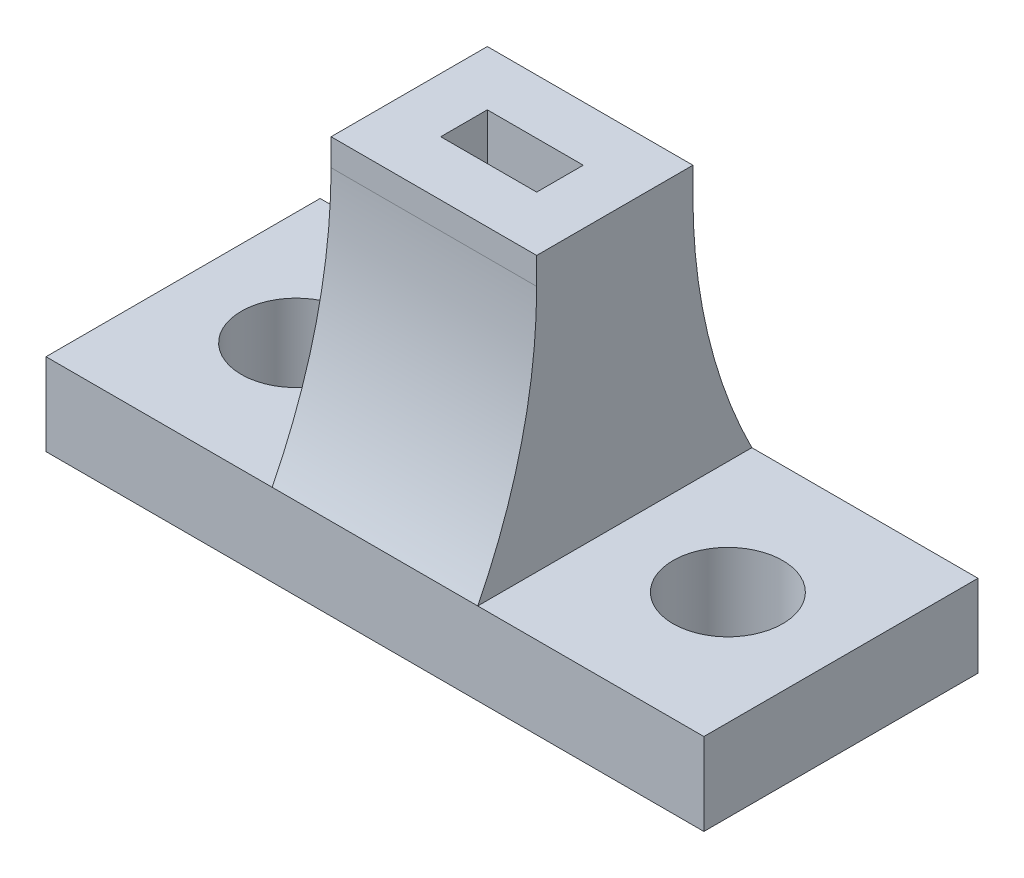
ISO-10303-21;
HEADER;
FILE_DESCRIPTION(('STEP AP214'),'2;1');
FILE_NAME('part.step','',(''),(''),'','','');
FILE_SCHEMA(('AUTOMOTIVE_DESIGN { 1 0 10303 214 1 1 1 1 }'));
ENDSEC;
DATA;
#1=APPLICATION_CONTEXT('core data for automotive mechanical design processes');
#2=APPLICATION_PROTOCOL_DEFINITION('international standard','automotive_design',2000,#1);
#3=PRODUCT_CONTEXT('',#1,'mechanical');
#4=PRODUCT('Part','Part','',(#3));
#5=PRODUCT_RELATED_PRODUCT_CATEGORY('part','',(#4));
#6=PRODUCT_DEFINITION_FORMATION('','',#4);
#7=PRODUCT_DEFINITION_CONTEXT('part definition',#1,'design');
#8=PRODUCT_DEFINITION('design','',#6,#7);
#9=PRODUCT_DEFINITION_SHAPE('','',#8);
#10=(LENGTH_UNIT() NAMED_UNIT(*) SI_UNIT(.MILLI.,.METRE.));
#11=(NAMED_UNIT(*) PLANE_ANGLE_UNIT() SI_UNIT($,.RADIAN.));
#12=(NAMED_UNIT(*) SI_UNIT($,.STERADIAN.) SOLID_ANGLE_UNIT());
#13=UNCERTAINTY_MEASURE_WITH_UNIT(LENGTH_MEASURE(1.E-05),#10,'distance_accuracy_value','');
#14=(GEOMETRIC_REPRESENTATION_CONTEXT(3) GLOBAL_UNCERTAINTY_ASSIGNED_CONTEXT((#13)) GLOBAL_UNIT_ASSIGNED_CONTEXT((#10,
#11,#12)) REPRESENTATION_CONTEXT('',''));
#15=CARTESIAN_POINT('',(0.,0.,0.));
#16=DIRECTION('',(0.,0.,1.));
#17=DIRECTION('',(1.,0.,0.));
#18=AXIS2_PLACEMENT_3D('',#15,#16,#17);
#19=CARTESIAN_POINT('',(0.,0.,0.));
#20=DIRECTION('',(0.,-1.,0.));
#21=DIRECTION('',(0.,0.,-1.));
#22=AXIS2_PLACEMENT_3D('',#19,#20,#21);
#23=PLANE('',#22);
#24=CARTESIAN_POINT('',(-7.875,0.,0.));
#25=DIRECTION('',(0.,1.,0.));
#26=DIRECTION('',(0.,0.,1.));
#27=AXIS2_PLACEMENT_3D('',#24,#25,#26);
#28=CIRCLE('',#27,2.);
#29=CARTESIAN_POINT('',(-7.875,0.,2.));
#30=VERTEX_POINT('',#29);
#31=EDGE_CURVE('E369',#30,#30,#28,.T.);
#32=ORIENTED_EDGE('',*,*,#31,.F.);
#33=EDGE_LOOP('',(#32));
#34=FACE_BOUND('',#33,.T.);
#35=DIRECTION('',(0.,0.,1.));
#36=VECTOR('',#35,1.);
#37=CARTESIAN_POINT('',(-3.75,0.,-2.85));
#38=LINE('',#37,#36);
#39=CARTESIAN_POINT('',(-3.75,0.,-5.));
#40=VERTEX_POINT('',#39);
#41=CARTESIAN_POINT('',(-3.75,0.,5.));
#42=VERTEX_POINT('',#41);
#43=EDGE_CURVE('E224',#40,#42,#38,.T.);
#44=ORIENTED_EDGE('',*,*,#43,.F.);
#45=DIRECTION('',(1.,0.,0.));
#46=VECTOR('',#45,1.);
#47=CARTESIAN_POINT('',(-12.,0.,-5.));
#48=LINE('',#47,#46);
#49=CARTESIAN_POINT('',(-12.,0.,-5.));
#50=VERTEX_POINT('',#49);
#51=EDGE_CURVE('E164',#50,#40,#48,.T.);
#52=ORIENTED_EDGE('',*,*,#51,.F.);
#53=DIRECTION('',(0.,0.,-1.));
#54=VECTOR('',#53,1.);
#55=CARTESIAN_POINT('',(-12.,0.,5.));
#56=LINE('',#55,#54);
#57=CARTESIAN_POINT('',(-12.,0.,5.));
#58=VERTEX_POINT('',#57);
#59=EDGE_CURVE('E276',#58,#50,#56,.T.);
#60=ORIENTED_EDGE('',*,*,#59,.F.);
#61=DIRECTION('',(-1.,0.,0.));
#62=VECTOR('',#61,1.);
#63=CARTESIAN_POINT('',(-12.,0.,5.));
#64=LINE('',#63,#62);
#65=EDGE_CURVE('E278',#42,#58,#64,.T.);
#66=ORIENTED_EDGE('',*,*,#65,.F.);
#67=EDGE_LOOP('',(#44,#52,#60,#66));
#68=FACE_BOUND('',#67,.T.);
#69=ADVANCED_FACE('F39',(#34,#68),#23,.F.);
#70=CARTESIAN_POINT('',(0.,10.,0.));
#71=DIRECTION('',(0.,1.,0.));
#72=DIRECTION('',(0.,0.,1.));
#73=AXIS2_PLACEMENT_3D('',#70,#71,#72);
#74=PLANE('',#73);
#75=DIRECTION('',(0.,0.,-1.));
#76=VECTOR('',#75,1.);
#77=CARTESIAN_POINT('',(3.75,10.,-2.85));
#78=LINE('',#77,#76);
#79=CARTESIAN_POINT('',(3.75,10.,2.85));
#80=VERTEX_POINT('',#79);
#81=CARTESIAN_POINT('',(3.75,10.,-2.85));
#82=VERTEX_POINT('',#81);
#83=EDGE_CURVE('E219',#80,#82,#78,.T.);
#84=ORIENTED_EDGE('',*,*,#83,.T.);
#85=DIRECTION('',(-1.,0.,0.));
#86=VECTOR('',#85,1.);
#87=CARTESIAN_POINT('',(-3.75,10.,-2.85));
#88=LINE('',#87,#86);
#89=CARTESIAN_POINT('',(-3.75,10.,-2.85));
#90=VERTEX_POINT('',#89);
#91=EDGE_CURVE('E223',#82,#90,#88,.T.);
#92=ORIENTED_EDGE('',*,*,#91,.T.);
#93=DIRECTION('',(0.,0.,1.));
#94=VECTOR('',#93,1.);
#95=CARTESIAN_POINT('',(-3.75,10.,-2.85));
#96=LINE('',#95,#94);
#97=CARTESIAN_POINT('',(-3.75,10.,2.85));
#98=VERTEX_POINT('',#97);
#99=EDGE_CURVE('E227',#90,#98,#96,.T.);
#100=ORIENTED_EDGE('',*,*,#99,.T.);
#101=DIRECTION('',(1.,0.,0.));
#102=VECTOR('',#101,1.);
#103=CARTESIAN_POINT('',(-3.75,10.,2.85));
#104=LINE('',#103,#102);
#105=EDGE_CURVE('E230',#98,#80,#104,.T.);
#106=ORIENTED_EDGE('',*,*,#105,.T.);
#107=EDGE_LOOP('',(#84,#92,#100,#106));
#108=FACE_BOUND('',#107,.T.);
#109=DIRECTION('',(-1.,0.,0.));
#110=VECTOR('',#109,1.);
#111=CARTESIAN_POINT('',(-1.75,10.,-0.85));
#112=LINE('',#111,#110);
#113=CARTESIAN_POINT('',(1.75,10.,-0.85));
#114=VERTEX_POINT('',#113);
#115=CARTESIAN_POINT('',(-1.75,10.,-0.85));
#116=VERTEX_POINT('',#115);
#117=EDGE_CURVE('E184',#114,#116,#112,.T.);
#118=ORIENTED_EDGE('',*,*,#117,.F.);
#119=DIRECTION('',(0.,0.,-1.));
#120=VECTOR('',#119,1.);
#121=CARTESIAN_POINT('',(1.75,10.,-0.85));
#122=LINE('',#121,#120);
#123=CARTESIAN_POINT('',(1.75,10.,0.85));
#124=VERTEX_POINT('',#123);
#125=EDGE_CURVE('E181',#124,#114,#122,.T.);
#126=ORIENTED_EDGE('',*,*,#125,.F.);
#127=DIRECTION('',(1.,0.,0.));
#128=VECTOR('',#127,1.);
#129=CARTESIAN_POINT('',(-1.75,10.,0.85));
#130=LINE('',#129,#128);
#131=CARTESIAN_POINT('',(-1.75,10.,0.85));
#132=VERTEX_POINT('',#131);
#133=EDGE_CURVE('E192',#132,#124,#130,.T.);
#134=ORIENTED_EDGE('',*,*,#133,.F.);
#135=DIRECTION('',(0.,0.,1.));
#136=VECTOR('',#135,1.);
#137=CARTESIAN_POINT('',(-1.75,10.,-0.85));
#138=LINE('',#137,#136);
#139=EDGE_CURVE('E188',#116,#132,#138,.T.);
#140=ORIENTED_EDGE('',*,*,#139,.F.);
#141=EDGE_LOOP('',(#118,#126,#134,#140));
#142=FACE_BOUND('',#141,.T.);
#143=ADVANCED_FACE('F316',(#108,#142),#74,.T.);
#144=CARTESIAN_POINT('',(3.75,10.,-2.85));
#145=DIRECTION('',(-1.,0.,0.));
#146=DIRECTION('',(0.,0.,1.));
#147=AXIS2_PLACEMENT_3D('',#144,#145,#146);
#148=PLANE('',#147);
#149=DIRECTION('',(0.,0.,-1.));
#150=VECTOR('',#149,1.);
#151=CARTESIAN_POINT('',(3.75,0.,-2.85));
#152=LINE('',#151,#150);
#153=CARTESIAN_POINT('',(3.75,0.,5.));
#154=VERTEX_POINT('',#153);
#155=CARTESIAN_POINT('',(3.75,0.,-5.));
#156=VERTEX_POINT('',#155);
#157=EDGE_CURVE('E218',#154,#156,#152,.T.);
#158=ORIENTED_EDGE('',*,*,#157,.T.);
#159=CARTESIAN_POINT('',(3.75,9.02094784376897,-22.85));
#160=DIRECTION('',(-1.,0.,0.));
#161=DIRECTION('',(0.,0.,1.));
#162=AXIS2_PLACEMENT_3D('',#159,#160,#161);
#163=CIRCLE('',#162,20.);
#164=CARTESIAN_POINT('',(3.75,9.02094784376896,-2.85));
#165=VERTEX_POINT('',#164);
#166=EDGE_CURVE('E263',#156,#165,#163,.T.);
#167=ORIENTED_EDGE('',*,*,#166,.T.);
#168=DIRECTION('',(0.,-1.,0.));
#169=VECTOR('',#168,1.);
#170=CARTESIAN_POINT('',(3.75,10.,-2.85));
#171=LINE('',#170,#169);
#172=EDGE_CURVE('E248',#82,#165,#171,.T.);
#173=ORIENTED_EDGE('',*,*,#172,.F.);
#174=ORIENTED_EDGE('',*,*,#83,.F.);
#175=DIRECTION('',(0.,-1.,0.));
#176=VECTOR('',#175,1.);
#177=CARTESIAN_POINT('',(3.75,10.,2.85));
#178=LINE('',#177,#176);
#179=CARTESIAN_POINT('',(3.75,9.02094784376897,2.85));
#180=VERTEX_POINT('',#179);
#181=EDGE_CURVE('E233',#80,#180,#178,.T.);
#182=ORIENTED_EDGE('',*,*,#181,.T.);
#183=CARTESIAN_POINT('',(3.75,9.02094784376897,22.85));
#184=DIRECTION('',(-1.,0.,0.));
#185=DIRECTION('',(0.,0.,1.));
#186=AXIS2_PLACEMENT_3D('',#183,#184,#185);
#187=CIRCLE('',#186,20.);
#188=EDGE_CURVE('E48',#180,#154,#187,.T.);
#189=ORIENTED_EDGE('',*,*,#188,.T.);
#190=EDGE_LOOP('',(#158,#167,#173,#174,#182,#189));
#191=FACE_BOUND('',#190,.T.);
#192=ADVANCED_FACE('F267',(#191),#148,.F.);
#193=CARTESIAN_POINT('',(-3.75,10.,-2.85));
#194=DIRECTION('',(0.,0.,1.));
#195=DIRECTION('',(1.,0.,0.));
#196=AXIS2_PLACEMENT_3D('',#193,#194,#195);
#197=PLANE('',#196);
#198=ORIENTED_EDGE('',*,*,#172,.T.);
#199=DIRECTION('',(-1.,0.,0.));
#200=VECTOR('',#199,1.);
#201=CARTESIAN_POINT('',(-3.75,9.02094784376897,-2.85));
#202=LINE('',#201,#200);
#203=CARTESIAN_POINT('',(-3.75,9.02094784376896,-2.85));
#204=VERTEX_POINT('',#203);
#205=EDGE_CURVE('E252',#165,#204,#202,.T.);
#206=ORIENTED_EDGE('',*,*,#205,.T.);
#207=DIRECTION('',(0.,-1.,0.));
#208=VECTOR('',#207,1.);
#209=CARTESIAN_POINT('',(-3.75,10.,-2.85));
#210=LINE('',#209,#208);
#211=EDGE_CURVE('E244',#90,#204,#210,.T.);
#212=ORIENTED_EDGE('',*,*,#211,.F.);
#213=ORIENTED_EDGE('',*,*,#91,.F.);
#214=EDGE_LOOP('',(#198,#206,#212,#213));
#215=FACE_BOUND('',#214,.T.);
#216=ADVANCED_FACE('F313',(#215),#197,.F.);
#217=CARTESIAN_POINT('',(-3.75,10.,-2.85));
#218=DIRECTION('',(1.,0.,0.));
#219=DIRECTION('',(0.,0.,-1.));
#220=AXIS2_PLACEMENT_3D('',#217,#218,#219);
#221=PLANE('',#220);
#222=ORIENTED_EDGE('',*,*,#43,.T.);
#223=CARTESIAN_POINT('',(-3.75,9.02094784376897,22.85));
#224=DIRECTION('',(1.,0.,0.));
#225=DIRECTION('',(0.,0.,-1.));
#226=AXIS2_PLACEMENT_3D('',#223,#224,#225);
#227=CIRCLE('',#226,20.);
#228=CARTESIAN_POINT('',(-3.75,9.02094784376897,2.85));
#229=VERTEX_POINT('',#228);
#230=EDGE_CURVE('E11',#42,#229,#227,.T.);
#231=ORIENTED_EDGE('',*,*,#230,.T.);
#232=DIRECTION('',(0.,-1.,0.));
#233=VECTOR('',#232,1.);
#234=CARTESIAN_POINT('',(-3.75,10.,2.85));
#235=LINE('',#234,#233);
#236=EDGE_CURVE('E241',#98,#229,#235,.T.);
#237=ORIENTED_EDGE('',*,*,#236,.F.);
#238=ORIENTED_EDGE('',*,*,#99,.F.);
#239=ORIENTED_EDGE('',*,*,#211,.T.);
#240=CARTESIAN_POINT('',(-3.75,9.02094784376897,-22.85));
#241=DIRECTION('',(1.,0.,0.));
#242=DIRECTION('',(0.,0.,-1.));
#243=AXIS2_PLACEMENT_3D('',#240,#241,#242);
#244=CIRCLE('',#243,20.);
#245=EDGE_CURVE('E259',#204,#40,#244,.T.);
#246=ORIENTED_EDGE('',*,*,#245,.T.);
#247=EDGE_LOOP('',(#222,#231,#237,#238,#239,#246));
#248=FACE_BOUND('',#247,.T.);
#249=ADVANCED_FACE('F305',(#248),#221,.F.);
#250=CARTESIAN_POINT('',(-3.75,10.,2.85));
#251=DIRECTION('',(0.,0.,-1.));
#252=DIRECTION('',(-1.,0.,0.));
#253=AXIS2_PLACEMENT_3D('',#250,#251,#252);
#254=PLANE('',#253);
#255=ORIENTED_EDGE('',*,*,#236,.T.);
#256=DIRECTION('',(1.,0.,0.));
#257=VECTOR('',#256,1.);
#258=CARTESIAN_POINT('',(-3.75,9.02094784376897,2.85));
#259=LINE('',#258,#257);
#260=EDGE_CURVE('E256',#229,#180,#259,.T.);
#261=ORIENTED_EDGE('',*,*,#260,.T.);
#262=ORIENTED_EDGE('',*,*,#181,.F.);
#263=ORIENTED_EDGE('',*,*,#105,.F.);
#264=EDGE_LOOP('',(#255,#261,#262,#263));
#265=FACE_BOUND('',#264,.T.);
#266=ADVANCED_FACE('F320',(#265),#254,.F.);
#267=CARTESIAN_POINT('',(1.75,10.,-0.85));
#268=DIRECTION('',(-1.,0.,0.));
#269=DIRECTION('',(0.,0.,1.));
#270=AXIS2_PLACEMENT_3D('',#267,#268,#269);
#271=PLANE('',#270);
#272=DIRECTION('',(0.,0.,-1.));
#273=VECTOR('',#272,1.);
#274=CARTESIAN_POINT('',(1.75,0.,-0.85));
#275=LINE('',#274,#273);
#276=CARTESIAN_POINT('',(1.75,0.,0.85));
#277=VERTEX_POINT('',#276);
#278=CARTESIAN_POINT('',(1.75,0.,-0.85));
#279=VERTEX_POINT('',#278);
#280=EDGE_CURVE('E170',#277,#279,#275,.T.);
#281=ORIENTED_EDGE('',*,*,#280,.F.);
#282=DIRECTION('',(0.,-1.,0.));
#283=VECTOR('',#282,1.);
#284=CARTESIAN_POINT('',(1.75,10.,0.85));
#285=LINE('',#284,#283);
#286=EDGE_CURVE('E194',#124,#277,#285,.T.);
#287=ORIENTED_EDGE('',*,*,#286,.F.);
#288=ORIENTED_EDGE('',*,*,#125,.T.);
#289=DIRECTION('',(0.,-1.,0.));
#290=VECTOR('',#289,1.);
#291=CARTESIAN_POINT('',(1.75,10.,-0.85));
#292=LINE('',#291,#290);
#293=EDGE_CURVE('E214',#114,#279,#292,.T.);
#294=ORIENTED_EDGE('',*,*,#293,.T.);
#295=EDGE_LOOP('',(#281,#287,#288,#294));
#296=FACE_BOUND('',#295,.T.);
#297=ADVANCED_FACE('F322',(#296),#271,.T.);
#298=CARTESIAN_POINT('',(-1.75,10.,-0.85));
#299=DIRECTION('',(0.,0.,1.));
#300=DIRECTION('',(1.,0.,0.));
#301=AXIS2_PLACEMENT_3D('',#298,#299,#300);
#302=PLANE('',#301);
#303=DIRECTION('',(-1.,0.,0.));
#304=VECTOR('',#303,1.);
#305=CARTESIAN_POINT('',(-1.75,0.,-0.85));
#306=LINE('',#305,#304);
#307=CARTESIAN_POINT('',(-1.75,0.,-0.85));
#308=VERTEX_POINT('',#307);
#309=EDGE_CURVE('E175',#279,#308,#306,.T.);
#310=ORIENTED_EDGE('',*,*,#309,.F.);
#311=ORIENTED_EDGE('',*,*,#293,.F.);
#312=ORIENTED_EDGE('',*,*,#117,.T.);
#313=DIRECTION('',(0.,-1.,0.));
#314=VECTOR('',#313,1.);
#315=CARTESIAN_POINT('',(-1.75,10.,-0.85));
#316=LINE('',#315,#314);
#317=EDGE_CURVE('E211',#116,#308,#316,.T.);
#318=ORIENTED_EDGE('',*,*,#317,.T.);
#319=EDGE_LOOP('',(#310,#311,#312,#318));
#320=FACE_BOUND('',#319,.T.);
#321=ADVANCED_FACE('F328',(#320),#302,.T.);
#322=CARTESIAN_POINT('',(-1.75,10.,-0.85));
#323=DIRECTION('',(1.,0.,0.));
#324=DIRECTION('',(0.,0.,-1.));
#325=AXIS2_PLACEMENT_3D('',#322,#323,#324);
#326=PLANE('',#325);
#327=DIRECTION('',(0.,0.,1.));
#328=VECTOR('',#327,1.);
#329=CARTESIAN_POINT('',(-1.75,0.,-0.85));
#330=LINE('',#329,#328);
#331=CARTESIAN_POINT('',(-1.75,0.,0.85));
#332=VERTEX_POINT('',#331);
#333=EDGE_CURVE('E199',#308,#332,#330,.T.);
#334=ORIENTED_EDGE('',*,*,#333,.F.);
#335=ORIENTED_EDGE('',*,*,#317,.F.);
#336=ORIENTED_EDGE('',*,*,#139,.T.);
#337=DIRECTION('',(0.,-1.,0.));
#338=VECTOR('',#337,1.);
#339=CARTESIAN_POINT('',(-1.75,10.,0.85));
#340=LINE('',#339,#338);
#341=EDGE_CURVE('E208',#132,#332,#340,.T.);
#342=ORIENTED_EDGE('',*,*,#341,.T.);
#343=EDGE_LOOP('',(#334,#335,#336,#342));
#344=FACE_BOUND('',#343,.T.);
#345=ADVANCED_FACE('F478',(#344),#326,.T.);
#346=CARTESIAN_POINT('',(-1.75,10.,0.85));
#347=DIRECTION('',(0.,0.,-1.));
#348=DIRECTION('',(-1.,0.,0.));
#349=AXIS2_PLACEMENT_3D('',#346,#347,#348);
#350=PLANE('',#349);
#351=DIRECTION('',(1.,0.,0.));
#352=VECTOR('',#351,1.);
#353=CARTESIAN_POINT('',(-1.75,0.,0.85));
#354=LINE('',#353,#352);
#355=EDGE_CURVE('E185',#332,#277,#354,.T.);
#356=ORIENTED_EDGE('',*,*,#355,.F.);
#357=ORIENTED_EDGE('',*,*,#341,.F.);
#358=ORIENTED_EDGE('',*,*,#133,.T.);
#359=ORIENTED_EDGE('',*,*,#286,.T.);
#360=EDGE_LOOP('',(#356,#357,#358,#359));
#361=FACE_BOUND('',#360,.T.);
#362=ADVANCED_FACE('F345',(#361),#350,.T.);
#363=ORIENTED_EDGE('',*,*,#355,.T.);
#364=ORIENTED_EDGE('',*,*,#280,.T.);
#365=ORIENTED_EDGE('',*,*,#309,.T.);
#366=ORIENTED_EDGE('',*,*,#333,.T.);
#367=EDGE_LOOP('',(#363,#364,#365,#366));
#368=FACE_BOUND('',#367,.T.);
#369=ADVANCED_FACE('F336',(#368),#23,.F.);
#370=CARTESIAN_POINT('',(12.,-3.,5.));
#371=DIRECTION('',(-1.,0.,0.));
#372=DIRECTION('',(0.,0.,1.));
#373=AXIS2_PLACEMENT_3D('',#370,#371,#372);
#374=PLANE('',#373);
#375=DIRECTION('',(0.,0.,1.));
#376=VECTOR('',#375,1.);
#377=CARTESIAN_POINT('',(12.,0.,5.));
#378=LINE('',#377,#376);
#379=CARTESIAN_POINT('',(12.,0.,-5.));
#380=VERTEX_POINT('',#379);
#381=CARTESIAN_POINT('',(12.,0.,5.));
#382=VERTEX_POINT('',#381);
#383=EDGE_CURVE('E168',#380,#382,#378,.T.);
#384=ORIENTED_EDGE('',*,*,#383,.T.);
#385=DIRECTION('',(0.,1.,0.));
#386=VECTOR('',#385,1.);
#387=CARTESIAN_POINT('',(12.,-3.,5.));
#388=LINE('',#387,#386);
#389=CARTESIAN_POINT('',(12.,-3.,5.));
#390=VERTEX_POINT('',#389);
#391=EDGE_CURVE('E146',#390,#382,#388,.T.);
#392=ORIENTED_EDGE('',*,*,#391,.F.);
#393=DIRECTION('',(0.,0.,1.));
#394=VECTOR('',#393,1.);
#395=CARTESIAN_POINT('',(12.,-3.,5.));
#396=LINE('',#395,#394);
#397=CARTESIAN_POINT('',(12.,-3.,-5.));
#398=VERTEX_POINT('',#397);
#399=EDGE_CURVE('E154',#398,#390,#396,.T.);
#400=ORIENTED_EDGE('',*,*,#399,.F.);
#401=DIRECTION('',(0.,1.,0.));
#402=VECTOR('',#401,1.);
#403=CARTESIAN_POINT('',(12.,-3.,-5.));
#404=LINE('',#403,#402);
#405=EDGE_CURVE('E291',#398,#380,#404,.T.);
#406=ORIENTED_EDGE('',*,*,#405,.T.);
#407=EDGE_LOOP('',(#384,#392,#400,#406));
#408=FACE_BOUND('',#407,.T.);
#409=ADVANCED_FACE('F166',(#408),#374,.F.);
#410=CARTESIAN_POINT('',(-12.,-3.,5.));
#411=DIRECTION('',(0.,0.,-1.));
#412=DIRECTION('',(-1.,0.,0.));
#413=AXIS2_PLACEMENT_3D('',#410,#411,#412);
#414=PLANE('',#413);
#415=EDGE_CURVE('E272',#382,#154,#64,.T.);
#416=ORIENTED_EDGE('',*,*,#415,.T.);
#417=EDGE_CURVE('E273',#154,#42,#64,.T.);
#418=ORIENTED_EDGE('',*,*,#417,.T.);
#419=ORIENTED_EDGE('',*,*,#65,.T.);
#420=DIRECTION('',(0.,1.,0.));
#421=VECTOR('',#420,1.);
#422=CARTESIAN_POINT('',(-12.,-3.,5.));
#423=LINE('',#422,#421);
#424=CARTESIAN_POINT('',(-12.,-3.,5.));
#425=VERTEX_POINT('',#424);
#426=EDGE_CURVE('E149',#425,#58,#423,.T.);
#427=ORIENTED_EDGE('',*,*,#426,.F.);
#428=DIRECTION('',(-1.,0.,0.));
#429=VECTOR('',#428,1.);
#430=CARTESIAN_POINT('',(-12.,-3.,5.));
#431=LINE('',#430,#429);
#432=EDGE_CURVE('E141',#390,#425,#431,.T.);
#433=ORIENTED_EDGE('',*,*,#432,.F.);
#434=ORIENTED_EDGE('',*,*,#391,.T.);
#435=EDGE_LOOP('',(#416,#418,#419,#427,#433,#434));
#436=FACE_BOUND('',#435,.T.);
#437=ADVANCED_FACE('F144',(#436),#414,.F.);
#438=CARTESIAN_POINT('',(-12.,-3.,5.));
#439=DIRECTION('',(1.,0.,0.));
#440=DIRECTION('',(0.,0.,-1.));
#441=AXIS2_PLACEMENT_3D('',#438,#439,#440);
#442=PLANE('',#441);
#443=ORIENTED_EDGE('',*,*,#59,.T.);
#444=DIRECTION('',(0.,1.,0.));
#445=VECTOR('',#444,1.);
#446=CARTESIAN_POINT('',(-12.,-3.,-5.));
#447=LINE('',#446,#445);
#448=CARTESIAN_POINT('',(-12.,-3.,-5.));
#449=VERTEX_POINT('',#448);
#450=EDGE_CURVE('E177',#449,#50,#447,.T.);
#451=ORIENTED_EDGE('',*,*,#450,.F.);
#452=DIRECTION('',(0.,0.,-1.));
#453=VECTOR('',#452,1.);
#454=CARTESIAN_POINT('',(-12.,-3.,5.));
#455=LINE('',#454,#453);
#456=EDGE_CURVE('E153',#425,#449,#455,.T.);
#457=ORIENTED_EDGE('',*,*,#456,.F.);
#458=ORIENTED_EDGE('',*,*,#426,.T.);
#459=EDGE_LOOP('',(#443,#451,#457,#458));
#460=FACE_BOUND('',#459,.T.);
#461=ADVANCED_FACE('F411',(#460),#442,.F.);
#462=CARTESIAN_POINT('',(-12.,-3.,-5.));
#463=DIRECTION('',(0.,0.,1.));
#464=DIRECTION('',(1.,0.,0.));
#465=AXIS2_PLACEMENT_3D('',#462,#463,#464);
#466=PLANE('',#465);
#467=ORIENTED_EDGE('',*,*,#51,.T.);
#468=EDGE_CURVE('E290',#40,#156,#48,.T.);
#469=ORIENTED_EDGE('',*,*,#468,.T.);
#470=EDGE_CURVE('E286',#156,#380,#48,.T.);
#471=ORIENTED_EDGE('',*,*,#470,.T.);
#472=ORIENTED_EDGE('',*,*,#405,.F.);
#473=DIRECTION('',(1.,0.,0.));
#474=VECTOR('',#473,1.);
#475=CARTESIAN_POINT('',(-12.,-3.,-5.));
#476=LINE('',#475,#474);
#477=EDGE_CURVE('E159',#449,#398,#476,.T.);
#478=ORIENTED_EDGE('',*,*,#477,.F.);
#479=ORIENTED_EDGE('',*,*,#450,.T.);
#480=EDGE_LOOP('',(#467,#469,#471,#472,#478,#479));
#481=FACE_BOUND('',#480,.T.);
#482=ADVANCED_FACE('F298',(#481),#466,.F.);
#483=CARTESIAN_POINT('',(0.,-3.,0.));
#484=DIRECTION('',(0.,-1.,0.));
#485=DIRECTION('',(0.,0.,-1.));
#486=AXIS2_PLACEMENT_3D('',#483,#484,#485);
#487=PLANE('',#486);
#488=CARTESIAN_POINT('',(-7.875,-3.,0.));
#489=DIRECTION('',(0.,1.,0.));
#490=DIRECTION('',(0.,0.,1.));
#491=AXIS2_PLACEMENT_3D('',#488,#489,#490);
#492=CIRCLE('',#491,2.);
#493=CARTESIAN_POINT('',(-7.875,-3.,2.));
#494=VERTEX_POINT('',#493);
#495=EDGE_CURVE('E373',#494,#494,#492,.T.);
#496=ORIENTED_EDGE('',*,*,#495,.T.);
#497=EDGE_LOOP('',(#496));
#498=FACE_BOUND('',#497,.T.);
#499=CARTESIAN_POINT('',(7.875,-3.,0.));
#500=DIRECTION('',(0.,1.,0.));
#501=DIRECTION('',(0.,0.,1.));
#502=AXIS2_PLACEMENT_3D('',#499,#500,#501);
#503=CIRCLE('',#502,2.);
#504=CARTESIAN_POINT('',(7.875,-3.,2.));
#505=VERTEX_POINT('',#504);
#506=EDGE_CURVE('E365',#505,#505,#503,.T.);
#507=ORIENTED_EDGE('',*,*,#506,.T.);
#508=EDGE_LOOP('',(#507));
#509=FACE_BOUND('',#508,.T.);
#510=ORIENTED_EDGE('',*,*,#399,.T.);
#511=ORIENTED_EDGE('',*,*,#432,.T.);
#512=ORIENTED_EDGE('',*,*,#456,.T.);
#513=ORIENTED_EDGE('',*,*,#477,.T.);
#514=EDGE_LOOP('',(#510,#511,#512,#513));
#515=FACE_BOUND('',#514,.T.);
#516=ADVANCED_FACE('F157',(#498,#509,#515),#487,.T.);
#517=CARTESIAN_POINT('',(7.875,0.,0.));
#518=DIRECTION('',(0.,1.,0.));
#519=DIRECTION('',(0.,0.,1.));
#520=AXIS2_PLACEMENT_3D('',#517,#518,#519);
#521=CIRCLE('',#520,2.);
#522=CARTESIAN_POINT('',(7.875,0.,2.));
#523=VERTEX_POINT('',#522);
#524=EDGE_CURVE('E356',#523,#523,#521,.T.);
#525=ORIENTED_EDGE('',*,*,#524,.F.);
#526=EDGE_LOOP('',(#525));
#527=FACE_BOUND('',#526,.T.);
#528=ORIENTED_EDGE('',*,*,#470,.F.);
#529=ORIENTED_EDGE('',*,*,#157,.F.);
#530=ORIENTED_EDGE('',*,*,#415,.F.);
#531=ORIENTED_EDGE('',*,*,#383,.F.);
#532=EDGE_LOOP('',(#528,#529,#530,#531));
#533=FACE_BOUND('',#532,.T.);
#534=ADVANCED_FACE('F337',(#527,#533),#23,.F.);
#535=CARTESIAN_POINT('',(0.,9.02094784376897,-22.85));
#536=DIRECTION('',(-1.,0.,0.));
#537=DIRECTION('',(0.,0.,1.));
#538=AXIS2_PLACEMENT_3D('',#535,#536,#537);
#539=CYLINDRICAL_SURFACE('',#538,20.);
#540=ORIENTED_EDGE('',*,*,#166,.F.);
#541=ORIENTED_EDGE('',*,*,#468,.F.);
#542=ORIENTED_EDGE('',*,*,#245,.F.);
#543=ORIENTED_EDGE('',*,*,#205,.F.);
#544=EDGE_LOOP('',(#540,#541,#542,#543));
#545=FACE_BOUND('',#544,.T.);
#546=ADVANCED_FACE('F311',(#545),#539,.F.);
#547=CARTESIAN_POINT('',(0.,9.02094784376897,22.85));
#548=DIRECTION('',(1.,0.,0.));
#549=DIRECTION('',(0.,0.,-1.));
#550=AXIS2_PLACEMENT_3D('',#547,#548,#549);
#551=CYLINDRICAL_SURFACE('',#550,20.);
#552=ORIENTED_EDGE('',*,*,#230,.F.);
#553=ORIENTED_EDGE('',*,*,#417,.F.);
#554=ORIENTED_EDGE('',*,*,#188,.F.);
#555=ORIENTED_EDGE('',*,*,#260,.F.);
#556=EDGE_LOOP('',(#552,#553,#554,#555));
#557=FACE_BOUND('',#556,.T.);
#558=ADVANCED_FACE('F41',(#557),#551,.F.);
#559=CARTESIAN_POINT('',(7.875,-3.,0.));
#560=DIRECTION('',(0.,1.,0.));
#561=DIRECTION('',(0.,0.,1.));
#562=AXIS2_PLACEMENT_3D('',#559,#560,#561);
#563=CYLINDRICAL_SURFACE('',#562,2.);
#564=ORIENTED_EDGE('',*,*,#506,.F.);
#565=EDGE_LOOP('',(#564));
#566=FACE_BOUND('',#565,.T.);
#567=ORIENTED_EDGE('',*,*,#524,.T.);
#568=EDGE_LOOP('',(#567));
#569=FACE_BOUND('',#568,.T.);
#570=ADVANCED_FACE('F383',(#566,#569),#563,.F.);
#571=CARTESIAN_POINT('',(-7.875,-3.,0.));
#572=DIRECTION('',(0.,1.,0.));
#573=DIRECTION('',(0.,0.,1.));
#574=AXIS2_PLACEMENT_3D('',#571,#572,#573);
#575=CYLINDRICAL_SURFACE('',#574,2.);
#576=ORIENTED_EDGE('',*,*,#495,.F.);
#577=EDGE_LOOP('',(#576));
#578=FACE_BOUND('',#577,.T.);
#579=ORIENTED_EDGE('',*,*,#31,.T.);
#580=EDGE_LOOP('',(#579));
#581=FACE_BOUND('',#580,.T.);
#582=ADVANCED_FACE('F380',(#578,#581),#575,.F.);
#583=CLOSED_SHELL('',(#69,#143,#192,#216,#249,#266,#297,#321,#345,#362,#369,#409,#437,#461,#482,
#516,#534,#546,#558,#570,#582));
#584=MANIFOLD_SOLID_BREP('B2',#583);
#585=ADVANCED_BREP_SHAPE_REPRESENTATION('',(#18,#584),#14);
#586=SHAPE_DEFINITION_REPRESENTATION(#9,#585);
ENDSEC;
END-ISO-10303-21;
